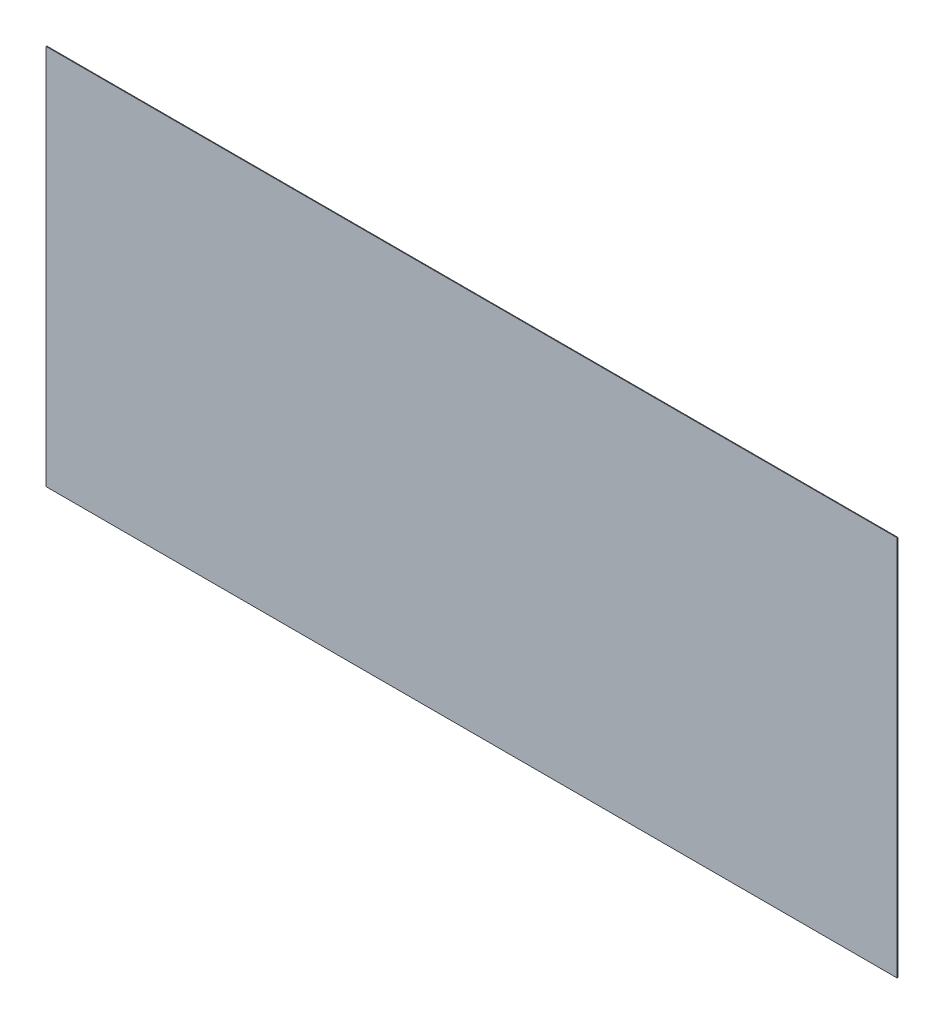
ISO-10303-21;
HEADER;
FILE_DESCRIPTION(('STEP AP214'),'2;1');
FILE_NAME('part.step','',(''),(''),'','','');
FILE_SCHEMA(('AUTOMOTIVE_DESIGN { 1 0 10303 214 1 1 1 1 }'));
ENDSEC;
DATA;
#1=APPLICATION_CONTEXT('core data for automotive mechanical design processes');
#2=APPLICATION_PROTOCOL_DEFINITION('international standard','automotive_design',2000,#1);
#3=PRODUCT_CONTEXT('',#1,'mechanical');
#4=PRODUCT('Part','Part','',(#3));
#5=PRODUCT_RELATED_PRODUCT_CATEGORY('part','',(#4));
#6=PRODUCT_DEFINITION_FORMATION('','',#4);
#7=PRODUCT_DEFINITION_CONTEXT('part definition',#1,'design');
#8=PRODUCT_DEFINITION('design','',#6,#7);
#9=PRODUCT_DEFINITION_SHAPE('','',#8);
#10=(LENGTH_UNIT() NAMED_UNIT(*) SI_UNIT(.MILLI.,.METRE.));
#11=(NAMED_UNIT(*) PLANE_ANGLE_UNIT() SI_UNIT($,.RADIAN.));
#12=(NAMED_UNIT(*) SI_UNIT($,.STERADIAN.) SOLID_ANGLE_UNIT());
#13=UNCERTAINTY_MEASURE_WITH_UNIT(LENGTH_MEASURE(1.E-05),#10,'distance_accuracy_value','');
#14=(GEOMETRIC_REPRESENTATION_CONTEXT(3) GLOBAL_UNCERTAINTY_ASSIGNED_CONTEXT((#13)) GLOBAL_UNIT_ASSIGNED_CONTEXT((#10,
#11,#12)) REPRESENTATION_CONTEXT('',''));
#15=CARTESIAN_POINT('',(0.,0.,0.));
#16=DIRECTION('',(0.,0.,1.));
#17=DIRECTION('',(1.,0.,0.));
#18=AXIS2_PLACEMENT_3D('',#15,#16,#17);
#19=CARTESIAN_POINT('',(-125.,-60.,151.4032));
#20=DIRECTION('',(1.,0.,0.));
#21=DIRECTION('',(0.,1.,0.));
#22=AXIS2_PLACEMENT_3D('',#19,#20,#21);
#23=PLANE('',#22);
#24=DIRECTION('',(0.,0.,1.));
#25=VECTOR('',#24,1.);
#26=CARTESIAN_POINT('',(-125.,19.,141.4032));
#27=LINE('',#26,#25);
#28=CARTESIAN_POINT('',(-125.,19.,151.327));
#29=VERTEX_POINT('',#28);
#30=CARTESIAN_POINT('',(-125.,19.,151.4032));
#31=VERTEX_POINT('',#30);
#32=EDGE_CURVE('E105',#29,#31,#27,.T.);
#33=ORIENTED_EDGE('',*,*,#32,.T.);
#34=DIRECTION('',(0.,-1.,0.));
#35=VECTOR('',#34,1.);
#36=CARTESIAN_POINT('',(-125.,-60.,151.4032));
#37=LINE('',#36,#35);
#38=CARTESIAN_POINT('',(-125.,60.,151.4032));
#39=VERTEX_POINT('',#38);
#40=EDGE_CURVE('E96',#39,#31,#37,.T.);
#41=ORIENTED_EDGE('',*,*,#40,.F.);
#42=DIRECTION('',(0.,0.,-1.));
#43=VECTOR('',#42,1.);
#44=CARTESIAN_POINT('',(-125.,60.,151.4032));
#45=LINE('',#44,#43);
#46=CARTESIAN_POINT('',(-125.,60.,151.327));
#47=VERTEX_POINT('',#46);
#48=EDGE_CURVE('E94',#39,#47,#45,.T.);
#49=ORIENTED_EDGE('',*,*,#48,.T.);
#50=DIRECTION('',(0.,-1.,0.));
#51=VECTOR('',#50,1.);
#52=CARTESIAN_POINT('',(-125.,-60.,151.327));
#53=LINE('',#52,#51);
#54=EDGE_CURVE('E102',#47,#29,#53,.T.);
#55=ORIENTED_EDGE('',*,*,#54,.T.);
#56=EDGE_LOOP('',(#33,#41,#49,#55));
#57=FACE_BOUND('',#56,.T.);
#58=ADVANCED_FACE('F41',(#57),#23,.F.);
#59=CARTESIAN_POINT('',(0.,0.,151.4032));
#60=DIRECTION('',(0.,0.,-1.));
#61=DIRECTION('',(-1.,0.,0.));
#62=AXIS2_PLACEMENT_3D('',#59,#60,#61);
#63=PLANE('',#62);
#64=DIRECTION('',(1.,0.,0.));
#65=VECTOR('',#64,1.);
#66=CARTESIAN_POINT('',(0.,19.,151.4032));
#67=LINE('',#66,#65);
#68=CARTESIAN_POINT('',(-33.5,19.,151.4032));
#69=VERTEX_POINT('',#68);
#70=EDGE_CURVE('E88',#31,#69,#67,.T.);
#71=ORIENTED_EDGE('',*,*,#70,.T.);
#72=DIRECTION('',(0.,-1.,0.));
#73=VECTOR('',#72,1.);
#74=CARTESIAN_POINT('',(-33.5,0.,151.4032));
#75=LINE('',#74,#73);
#76=CARTESIAN_POINT('',(-33.5,60.,151.4032));
#77=VERTEX_POINT('',#76);
#78=EDGE_CURVE('E83',#77,#69,#75,.T.);
#79=ORIENTED_EDGE('',*,*,#78,.F.);
#80=DIRECTION('',(-1.,0.,0.));
#81=VECTOR('',#80,1.);
#82=CARTESIAN_POINT('',(-125.,60.,151.4032));
#83=LINE('',#82,#81);
#84=EDGE_CURVE('E64',#77,#39,#83,.T.);
#85=ORIENTED_EDGE('',*,*,#84,.T.);
#86=ORIENTED_EDGE('',*,*,#40,.T.);
#87=EDGE_LOOP('',(#71,#79,#85,#86));
#88=FACE_BOUND('',#87,.T.);
#89=ADVANCED_FACE('F90',(#88),#63,.F.);
#90=CARTESIAN_POINT('',(0.,0.,151.327));
#91=DIRECTION('',(0.,0.,-1.));
#92=DIRECTION('',(-1.,0.,0.));
#93=AXIS2_PLACEMENT_3D('',#90,#91,#92);
#94=PLANE('',#93);
#95=DIRECTION('',(0.,1.,0.));
#96=VECTOR('',#95,1.);
#97=CARTESIAN_POINT('',(-33.5,0.,151.327));
#98=LINE('',#97,#96);
#99=CARTESIAN_POINT('',(-33.5,19.,151.327));
#100=VERTEX_POINT('',#99);
#101=CARTESIAN_POINT('',(-33.5,60.,151.327));
#102=VERTEX_POINT('',#101);
#103=EDGE_CURVE('E48',#100,#102,#98,.T.);
#104=ORIENTED_EDGE('',*,*,#103,.F.);
#105=DIRECTION('',(-1.,0.,0.));
#106=VECTOR('',#105,1.);
#107=CARTESIAN_POINT('',(0.,19.,151.327));
#108=LINE('',#107,#106);
#109=EDGE_CURVE('E11',#100,#29,#108,.T.);
#110=ORIENTED_EDGE('',*,*,#109,.T.);
#111=ORIENTED_EDGE('',*,*,#54,.F.);
#112=DIRECTION('',(-1.,0.,0.));
#113=VECTOR('',#112,1.);
#114=CARTESIAN_POINT('',(-125.,60.,151.327));
#115=LINE('',#114,#113);
#116=EDGE_CURVE('E99',#102,#47,#115,.T.);
#117=ORIENTED_EDGE('',*,*,#116,.F.);
#118=EDGE_LOOP('',(#104,#110,#111,#117));
#119=FACE_BOUND('',#118,.T.);
#120=ADVANCED_FACE('F110',(#119),#94,.T.);
#121=CARTESIAN_POINT('',(-125.,60.,151.4032));
#122=DIRECTION('',(0.,-1.,0.));
#123=DIRECTION('',(1.,0.,0.));
#124=AXIS2_PLACEMENT_3D('',#121,#122,#123);
#125=PLANE('',#124);
#126=ORIENTED_EDGE('',*,*,#84,.F.);
#127=DIRECTION('',(0.,0.,1.));
#128=VECTOR('',#127,1.);
#129=CARTESIAN_POINT('',(-33.5,60.,141.4032));
#130=LINE('',#129,#128);
#131=EDGE_CURVE('E81',#102,#77,#130,.T.);
#132=ORIENTED_EDGE('',*,*,#131,.F.);
#133=ORIENTED_EDGE('',*,*,#116,.T.);
#134=ORIENTED_EDGE('',*,*,#48,.F.);
#135=EDGE_LOOP('',(#126,#132,#133,#134));
#136=FACE_BOUND('',#135,.T.);
#137=ADVANCED_FACE('F92',(#136),#125,.F.);
#138=CARTESIAN_POINT('',(0.,19.,141.4032));
#139=DIRECTION('',(0.,-1.,0.));
#140=DIRECTION('',(0.,0.,-1.));
#141=AXIS2_PLACEMENT_3D('',#138,#139,#140);
#142=PLANE('',#141);
#143=DIRECTION('',(0.,0.,1.));
#144=VECTOR('',#143,1.);
#145=CARTESIAN_POINT('',(-33.5,19.,141.4032));
#146=LINE('',#145,#144);
#147=EDGE_CURVE('E55',#100,#69,#146,.T.);
#148=ORIENTED_EDGE('',*,*,#147,.T.);
#149=ORIENTED_EDGE('',*,*,#70,.F.);
#150=ORIENTED_EDGE('',*,*,#32,.F.);
#151=ORIENTED_EDGE('',*,*,#109,.F.);
#152=EDGE_LOOP('',(#148,#149,#150,#151));
#153=FACE_BOUND('',#152,.T.);
#154=ADVANCED_FACE('F112',(#153),#142,.T.);
#155=CARTESIAN_POINT('',(-33.5,0.,141.4032));
#156=DIRECTION('',(-1.,0.,0.));
#157=DIRECTION('',(0.,0.,1.));
#158=AXIS2_PLACEMENT_3D('',#155,#156,#157);
#159=PLANE('',#158);
#160=ORIENTED_EDGE('',*,*,#103,.T.);
#161=ORIENTED_EDGE('',*,*,#131,.T.);
#162=ORIENTED_EDGE('',*,*,#78,.T.);
#163=ORIENTED_EDGE('',*,*,#147,.F.);
#164=EDGE_LOOP('',(#160,#161,#162,#163));
#165=FACE_BOUND('',#164,.T.);
#166=ADVANCED_FACE('F82',(#165),#159,.F.);
#167=CLOSED_SHELL('',(#58,#89,#120,#137,#154,#166));
#168=MANIFOLD_SOLID_BREP('B2',#167);
#169=ADVANCED_BREP_SHAPE_REPRESENTATION('',(#18,#168),#14);
#170=SHAPE_DEFINITION_REPRESENTATION(#9,#169);
ENDSEC;
END-ISO-10303-21;
